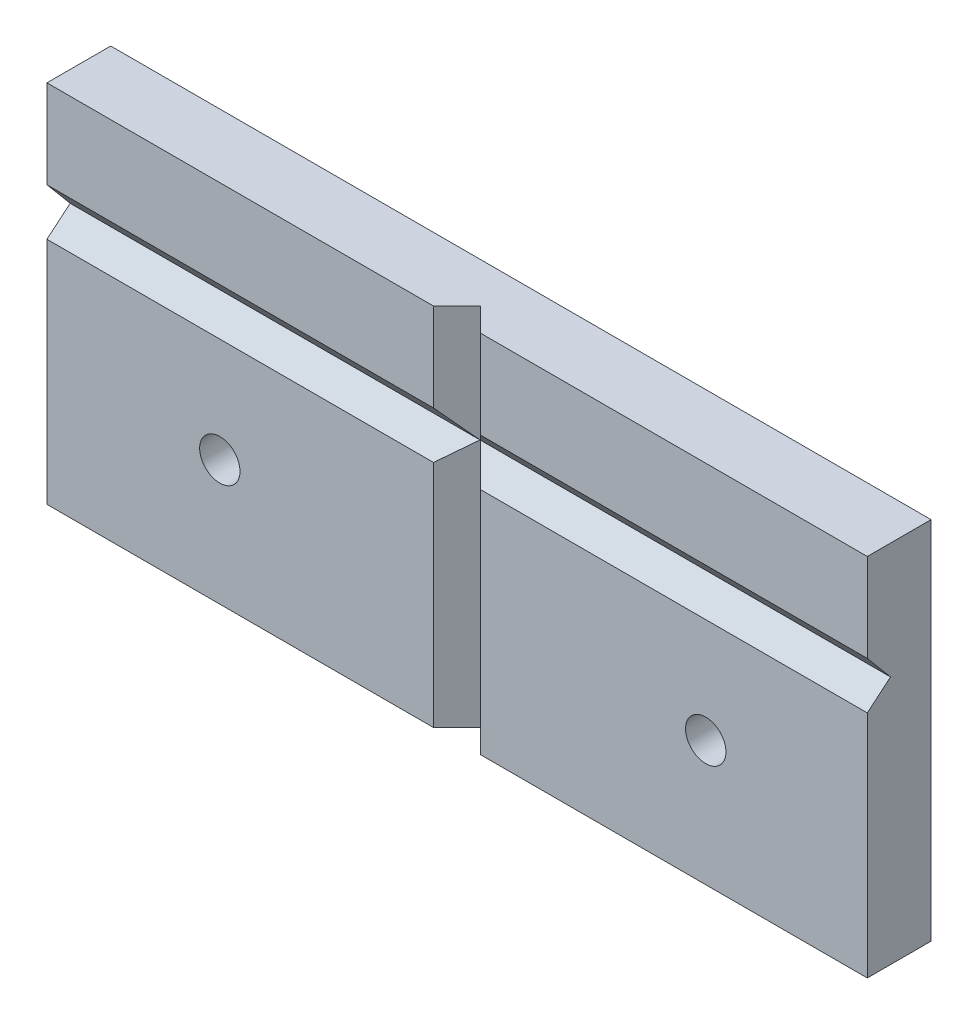
ISO-10303-21;
HEADER;
FILE_DESCRIPTION(('STEP AP214'),'2;1');
FILE_NAME('part.step','',(''),(''),'','','');
FILE_SCHEMA(('AUTOMOTIVE_DESIGN { 1 0 10303 214 1 1 1 1 }'));
ENDSEC;
DATA;
#1=APPLICATION_CONTEXT('core data for automotive mechanical design processes');
#2=APPLICATION_PROTOCOL_DEFINITION('international standard','automotive_design',2000,#1);
#3=PRODUCT_CONTEXT('',#1,'mechanical');
#4=PRODUCT('Part','Part','',(#3));
#5=PRODUCT_RELATED_PRODUCT_CATEGORY('part','',(#4));
#6=PRODUCT_DEFINITION_FORMATION('','',#4);
#7=PRODUCT_DEFINITION_CONTEXT('part definition',#1,'design');
#8=PRODUCT_DEFINITION('design','',#6,#7);
#9=PRODUCT_DEFINITION_SHAPE('','',#8);
#10=(LENGTH_UNIT() NAMED_UNIT(*) SI_UNIT(.MILLI.,.METRE.));
#11=(NAMED_UNIT(*) PLANE_ANGLE_UNIT() SI_UNIT($,.RADIAN.));
#12=(NAMED_UNIT(*) SI_UNIT($,.STERADIAN.) SOLID_ANGLE_UNIT());
#13=UNCERTAINTY_MEASURE_WITH_UNIT(LENGTH_MEASURE(1.E-05),#10,'distance_accuracy_value','');
#14=(GEOMETRIC_REPRESENTATION_CONTEXT(3) GLOBAL_UNCERTAINTY_ASSIGNED_CONTEXT((#13)) GLOBAL_UNIT_ASSIGNED_CONTEXT((#10,
#11,#12)) REPRESENTATION_CONTEXT('',''));
#15=CARTESIAN_POINT('',(0.,0.,0.));
#16=DIRECTION('',(0.,0.,1.));
#17=DIRECTION('',(1.,0.,0.));
#18=AXIS2_PLACEMENT_3D('',#15,#16,#17);
#19=CARTESIAN_POINT('',(0.,0.,7.8994));
#20=DIRECTION('',(0.,0.,1.));
#21=DIRECTION('',(1.,0.,0.));
#22=AXIS2_PLACEMENT_3D('',#19,#20,#21);
#23=PLANE('',#22);
#24=DIRECTION('',(-1.,0.,0.));
#25=VECTOR('',#24,1.);
#26=CARTESIAN_POINT('',(0.,83.312,7.8994));
#27=LINE('',#26,#25);
#28=CARTESIAN_POINT('',(0.,83.312,7.8994));
#29=VERTEX_POINT('',#28);
#30=CARTESIAN_POINT('',(-47.879,83.312,7.89939999999999));
#31=VERTEX_POINT('',#30);
#32=EDGE_CURVE('E180',#29,#31,#27,.T.);
#33=ORIENTED_EDGE('',*,*,#32,.T.);
#34=DIRECTION('',(0.,-1.,0.));
#35=VECTOR('',#34,1.);
#36=CARTESIAN_POINT('',(-47.879,236.339016687857,7.89939999999999));
#37=LINE('',#36,#35);
#38=CARTESIAN_POINT('',(-47.879,72.3761950037828,7.8994));
#39=VERTEX_POINT('',#38);
#40=EDGE_CURVE('E139',#31,#39,#37,.T.);
#41=ORIENTED_EDGE('',*,*,#40,.T.);
#42=DIRECTION('',(1.,0.,0.));
#43=VECTOR('',#42,1.);
#44=CARTESIAN_POINT('',(0.,72.3761950037828,7.8994));
#45=LINE('',#44,#43);
#46=CARTESIAN_POINT('',(0.,72.3761950037828,7.8994));
#47=VERTEX_POINT('',#46);
#48=EDGE_CURVE('E218',#39,#47,#45,.T.);
#49=ORIENTED_EDGE('',*,*,#48,.T.);
#50=DIRECTION('',(0.,1.,0.));
#51=VECTOR('',#50,1.);
#52=CARTESIAN_POINT('',(0.,38.1,7.8994));
#53=LINE('',#52,#51);
#54=EDGE_CURVE('E190',#47,#29,#53,.T.);
#55=ORIENTED_EDGE('',*,*,#54,.T.);
#56=EDGE_LOOP('',(#33,#41,#49,#55));
#57=FACE_BOUND('',#56,.T.);
#58=ADVANCED_FACE('F37',(#57),#23,.T.);
#59=CARTESIAN_POINT('',(-101.6,72.3761950037828,7.8994));
#60=VERTEX_POINT('',#59);
#61=CARTESIAN_POINT('',(-53.721,72.3761950037828,7.89939999999999));
#62=VERTEX_POINT('',#61);
#63=EDGE_CURVE('E219',#60,#62,#45,.T.);
#64=ORIENTED_EDGE('',*,*,#63,.T.);
#65=DIRECTION('',(0.,-1.,0.));
#66=VECTOR('',#65,1.);
#67=CARTESIAN_POINT('',(-53.721,236.339016687857,7.89939999999999));
#68=LINE('',#67,#66);
#69=CARTESIAN_POINT('',(-53.721,83.312,7.89939999999999));
#70=VERTEX_POINT('',#69);
#71=EDGE_CURVE('E234',#70,#62,#68,.T.);
#72=ORIENTED_EDGE('',*,*,#71,.F.);
#73=CARTESIAN_POINT('',(-101.6,83.312,7.8994));
#74=VERTEX_POINT('',#73);
#75=EDGE_CURVE('E157',#70,#74,#27,.T.);
#76=ORIENTED_EDGE('',*,*,#75,.T.);
#77=DIRECTION('',(0.,-1.,0.));
#78=VECTOR('',#77,1.);
#79=CARTESIAN_POINT('',(-101.6,83.312,7.8994));
#80=LINE('',#79,#78);
#81=EDGE_CURVE('E183',#74,#60,#80,.T.);
#82=ORIENTED_EDGE('',*,*,#81,.T.);
#83=EDGE_LOOP('',(#64,#72,#76,#82));
#84=FACE_BOUND('',#83,.T.);
#85=ADVANCED_FACE('F233',(#84),#23,.T.);
#86=CARTESIAN_POINT('',(-20.0048383256093,53.5862401288938,7.8994));
#87=DIRECTION('',(0.,0.,-1.));
#88=DIRECTION('',(-1.,0.,0.));
#89=AXIS2_PLACEMENT_3D('',#86,#87,#88);
#90=CIRCLE('',#89,2.5);
#91=CARTESIAN_POINT('',(-22.5048383256093,53.5862401288938,7.8994));
#92=VERTEX_POINT('',#91);
#93=EDGE_CURVE('E418',#92,#92,#90,.T.);
#94=ORIENTED_EDGE('',*,*,#93,.T.);
#95=EDGE_LOOP('',(#94));
#96=FACE_BOUND('',#95,.T.);
#97=DIRECTION('',(-1.,0.,0.));
#98=VECTOR('',#97,1.);
#99=CARTESIAN_POINT('',(0.,66.5341950037828,7.8994));
#100=LINE('',#99,#98);
#101=CARTESIAN_POINT('',(0.,66.5341950037828,7.8994));
#102=VERTEX_POINT('',#101);
#103=CARTESIAN_POINT('',(-47.879,66.5341950037828,7.89939999999999));
#104=VERTEX_POINT('',#103);
#105=EDGE_CURVE('E215',#102,#104,#100,.T.);
#106=ORIENTED_EDGE('',*,*,#105,.T.);
#107=CARTESIAN_POINT('',(-47.879,38.1,7.89939999999999));
#108=VERTEX_POINT('',#107);
#109=EDGE_CURVE('E235',#104,#108,#37,.T.);
#110=ORIENTED_EDGE('',*,*,#109,.T.);
#111=DIRECTION('',(1.,0.,0.));
#112=VECTOR('',#111,1.);
#113=CARTESIAN_POINT('',(-101.6,38.1,7.8994));
#114=LINE('',#113,#112);
#115=CARTESIAN_POINT('',(0.,38.1,7.8994));
#116=VERTEX_POINT('',#115);
#117=EDGE_CURVE('E186',#108,#116,#114,.T.);
#118=ORIENTED_EDGE('',*,*,#117,.T.);
#119=EDGE_CURVE('E191',#116,#102,#53,.T.);
#120=ORIENTED_EDGE('',*,*,#119,.T.);
#121=EDGE_LOOP('',(#106,#110,#118,#120));
#122=FACE_BOUND('',#121,.T.);
#123=ADVANCED_FACE('F263',(#96,#122),#23,.T.);
#124=CARTESIAN_POINT('',(-80.1872457791835,53.5862401288938,7.8994));
#125=DIRECTION('',(0.,0.,-1.));
#126=DIRECTION('',(-1.,0.,0.));
#127=AXIS2_PLACEMENT_3D('',#124,#125,#126);
#128=CIRCLE('',#127,2.5);
#129=CARTESIAN_POINT('',(-82.6872457791835,53.5862401288938,7.8994));
#130=VERTEX_POINT('',#129);
#131=EDGE_CURVE('E153',#130,#130,#128,.T.);
#132=ORIENTED_EDGE('',*,*,#131,.T.);
#133=EDGE_LOOP('',(#132));
#134=FACE_BOUND('',#133,.T.);
#135=CARTESIAN_POINT('',(-101.6,38.1,7.8994));
#136=VERTEX_POINT('',#135);
#137=CARTESIAN_POINT('',(-53.721,38.1,7.89939999999999));
#138=VERTEX_POINT('',#137);
#139=EDGE_CURVE('E187',#136,#138,#114,.T.);
#140=ORIENTED_EDGE('',*,*,#139,.T.);
#141=CARTESIAN_POINT('',(-53.721,66.5341950037828,7.89939999999999));
#142=VERTEX_POINT('',#141);
#143=EDGE_CURVE('E152',#142,#138,#68,.T.);
#144=ORIENTED_EDGE('',*,*,#143,.F.);
#145=CARTESIAN_POINT('',(-101.6,66.5341950037828,7.8994));
#146=VERTEX_POINT('',#145);
#147=EDGE_CURVE('E60',#142,#146,#100,.T.);
#148=ORIENTED_EDGE('',*,*,#147,.T.);
#149=EDGE_CURVE('E182',#146,#136,#80,.T.);
#150=ORIENTED_EDGE('',*,*,#149,.T.);
#151=EDGE_LOOP('',(#140,#144,#148,#150));
#152=FACE_BOUND('',#151,.T.);
#153=ADVANCED_FACE('F261',(#134,#152),#23,.T.);
#154=CARTESIAN_POINT('',(0.,83.312,7.8994));
#155=DIRECTION('',(0.,-1.,0.));
#156=DIRECTION('',(0.,0.,-1.));
#157=AXIS2_PLACEMENT_3D('',#154,#155,#156);
#158=PLANE('',#157);
#159=DIRECTION('',(-0.707106781186549,0.,-0.707106781186546));
#160=VECTOR('',#159,1.);
#161=CARTESIAN_POINT('',(-23.9394999999999,83.312,31.8389));
#162=LINE('',#161,#160);
#163=CARTESIAN_POINT('',(-50.8,83.312,4.9784));
#164=VERTEX_POINT('',#163);
#165=EDGE_CURVE('E133',#31,#164,#162,.T.);
#166=ORIENTED_EDGE('',*,*,#165,.F.);
#167=ORIENTED_EDGE('',*,*,#32,.F.);
#168=DIRECTION('',(0.,0.,-1.));
#169=VECTOR('',#168,1.);
#170=CARTESIAN_POINT('',(0.,83.312,7.8994));
#171=LINE('',#170,#169);
#172=CARTESIAN_POINT('',(0.,83.312,0.));
#173=VERTEX_POINT('',#172);
#174=EDGE_CURVE('E194',#29,#173,#171,.T.);
#175=ORIENTED_EDGE('',*,*,#174,.T.);
#176=DIRECTION('',(-1.,0.,0.));
#177=VECTOR('',#176,1.);
#178=CARTESIAN_POINT('',(0.,83.312,0.));
#179=LINE('',#178,#177);
#180=CARTESIAN_POINT('',(-101.6,83.312,0.));
#181=VERTEX_POINT('',#180);
#182=EDGE_CURVE('E179',#173,#181,#179,.T.);
#183=ORIENTED_EDGE('',*,*,#182,.T.);
#184=DIRECTION('',(0.,0.,-1.));
#185=VECTOR('',#184,1.);
#186=CARTESIAN_POINT('',(-101.6,83.312,7.8994));
#187=LINE('',#186,#185);
#188=EDGE_CURVE('E212',#74,#181,#187,.T.);
#189=ORIENTED_EDGE('',*,*,#188,.F.);
#190=ORIENTED_EDGE('',*,*,#75,.F.);
#191=DIRECTION('',(-0.70710678118655,0.,0.707106781186545));
#192=VECTOR('',#191,1.);
#193=CARTESIAN_POINT('',(-26.8604999999998,83.312,-18.9611));
#194=LINE('',#193,#192);
#195=EDGE_CURVE('E148',#164,#70,#194,.T.);
#196=ORIENTED_EDGE('',*,*,#195,.F.);
#197=EDGE_LOOP('',(#166,#167,#175,#183,#189,#190,#196));
#198=FACE_BOUND('',#197,.T.);
#199=ADVANCED_FACE('F39',(#198),#158,.F.);
#200=CARTESIAN_POINT('',(-31.75,38.1,7.8994));
#201=DIRECTION('',(0.,1.,0.));
#202=DIRECTION('',(0.,0.,1.));
#203=AXIS2_PLACEMENT_3D('',#200,#201,#202);
#204=PLANE('',#203);
#205=DIRECTION('',(0.707106781186549,0.,0.707106781186546));
#206=VECTOR('',#205,1.);
#207=CARTESIAN_POINT('',(-39.8145,38.1,15.9639));
#208=LINE('',#207,#206);
#209=CARTESIAN_POINT('',(-50.8,38.1,4.9784));
#210=VERTEX_POINT('',#209);
#211=EDGE_CURVE('E145',#210,#108,#208,.T.);
#212=ORIENTED_EDGE('',*,*,#211,.F.);
#213=DIRECTION('',(0.70710678118655,0.,-0.707106781186545));
#214=VECTOR('',#213,1.);
#215=CARTESIAN_POINT('',(-42.7354999999999,38.1,-3.08610000000001));
#216=LINE('',#215,#214);
#217=EDGE_CURVE('E151',#138,#210,#216,.T.);
#218=ORIENTED_EDGE('',*,*,#217,.F.);
#219=ORIENTED_EDGE('',*,*,#139,.F.);
#220=DIRECTION('',(0.,0.,-1.));
#221=VECTOR('',#220,1.);
#222=CARTESIAN_POINT('',(-101.6,38.1,7.8994));
#223=LINE('',#222,#221);
#224=CARTESIAN_POINT('',(-101.6,38.1,0.));
#225=VERTEX_POINT('',#224);
#226=EDGE_CURVE('E209',#136,#225,#223,.T.);
#227=ORIENTED_EDGE('',*,*,#226,.T.);
#228=DIRECTION('',(1.,0.,0.));
#229=VECTOR('',#228,1.);
#230=CARTESIAN_POINT('',(-31.75,38.1,0.));
#231=LINE('',#230,#229);
#232=CARTESIAN_POINT('',(0.,38.1,0.));
#233=VERTEX_POINT('',#232);
#234=EDGE_CURVE('E200',#225,#233,#231,.T.);
#235=ORIENTED_EDGE('',*,*,#234,.T.);
#236=DIRECTION('',(0.,0.,-1.));
#237=VECTOR('',#236,1.);
#238=CARTESIAN_POINT('',(0.,38.1,7.8994));
#239=LINE('',#238,#237);
#240=EDGE_CURVE('E206',#116,#233,#239,.T.);
#241=ORIENTED_EDGE('',*,*,#240,.F.);
#242=ORIENTED_EDGE('',*,*,#117,.F.);
#243=EDGE_LOOP('',(#212,#218,#219,#227,#235,#241,#242));
#244=FACE_BOUND('',#243,.T.);
#245=ADVANCED_FACE('F259',(#244),#204,.F.);
#246=CARTESIAN_POINT('',(-240.957260442585,72.3761950037828,7.8994));
#247=DIRECTION('',(0.,-0.643029175427612,0.765841680472462));
#248=DIRECTION('',(0.,-0.765841680472462,-0.643029175427612));
#249=AXIS2_PLACEMENT_3D('',#246,#247,#248);
#250=PLANE('',#249);
#251=ORIENTED_EDGE('',*,*,#48,.F.);
#252=DIRECTION('',(-0.540859973441894,-0.644159124950403,-0.540859973441892));
#253=VECTOR('',#252,1.);
#254=CARTESIAN_POINT('',(-104.360089087202,5.10775084229825,-48.5816890872022));
#255=LINE('',#254,#253);
#256=CARTESIAN_POINT('',(-50.7559428158141,68.9497832562582,5.02245718418594));
#257=VERTEX_POINT('',#256);
#258=EDGE_CURVE('E158',#39,#257,#255,.T.);
#259=ORIENTED_EDGE('',*,*,#258,.T.);
#260=DIRECTION('',(1.,0.,0.));
#261=VECTOR('',#260,1.);
#262=CARTESIAN_POINT('',(-240.957260442585,68.9497832562582,5.02245718418594));
#263=LINE('',#262,#261);
#264=CARTESIAN_POINT('',(0.,68.9497832562582,5.02245718418594));
#265=VERTEX_POINT('',#264);
#266=EDGE_CURVE('E144',#257,#265,#263,.T.);
#267=ORIENTED_EDGE('',*,*,#266,.T.);
#268=DIRECTION('',(0.,0.765841680472462,0.643029175427612));
#269=VECTOR('',#268,1.);
#270=CARTESIAN_POINT('',(0.,52.272744606418,-8.98020509578478));
#271=LINE('',#270,#269);
#272=EDGE_CURVE('E174',#265,#47,#271,.T.);
#273=ORIENTED_EDGE('',*,*,#272,.T.);
#274=EDGE_LOOP('',(#251,#259,#267,#273));
#275=FACE_BOUND('',#274,.T.);
#276=ADVANCED_FACE('F244',(#275),#250,.T.);
#277=CARTESIAN_POINT('',(-101.6,68.9497832562582,5.02245718418594));
#278=VERTEX_POINT('',#277);
#279=CARTESIAN_POINT('',(-50.844057184186,68.9497832562582,5.02245718418594));
#280=VERTEX_POINT('',#279);
#281=EDGE_CURVE('E166',#278,#280,#263,.T.);
#282=ORIENTED_EDGE('',*,*,#281,.T.);
#283=DIRECTION('',(-0.540859973441895,0.644159124950403,0.540859973441892));
#284=VECTOR('',#283,1.);
#285=CARTESIAN_POINT('',(-108.493131684691,137.609287024169,62.6715316846905));
#286=LINE('',#285,#284);
#287=EDGE_CURVE('E52',#280,#62,#286,.T.);
#288=ORIENTED_EDGE('',*,*,#287,.T.);
#289=ORIENTED_EDGE('',*,*,#63,.F.);
#290=DIRECTION('',(0.,-0.765841680472462,-0.643029175427612));
#291=VECTOR('',#290,1.);
#292=CARTESIAN_POINT('',(-101.6,78.7901920437822,13.284830609211));
#293=LINE('',#292,#291);
#294=EDGE_CURVE('E177',#60,#278,#293,.T.);
#295=ORIENTED_EDGE('',*,*,#294,.T.);
#296=EDGE_LOOP('',(#282,#288,#289,#295));
#297=FACE_BOUND('',#296,.T.);
#298=ADVANCED_FACE('F226',(#297),#250,.T.);
#299=CARTESIAN_POINT('',(-240.957260442585,68.9497832562582,5.02245718418594));
#300=DIRECTION('',(0.,0.765841680472463,0.643029175427612));
#301=DIRECTION('',(0.,-0.643029175427612,0.765841680472463));
#302=AXIS2_PLACEMENT_3D('',#299,#300,#301);
#303=PLANE('',#302);
#304=ORIENTED_EDGE('',*,*,#266,.F.);
#305=DIRECTION('',(0.608018950895575,-0.510515338362809,0.608018950895572));
#306=VECTOR('',#305,1.);
#307=CARTESIAN_POINT('',(-121.07090581744,127.988842936667,-65.2925058174398));
#308=LINE('',#307,#306);
#309=EDGE_CURVE('E11',#257,#104,#308,.T.);
#310=ORIENTED_EDGE('',*,*,#309,.T.);
#311=ORIENTED_EDGE('',*,*,#105,.F.);
#312=DIRECTION('',(0.,0.643029175427612,-0.765841680472463));
#313=VECTOR('',#312,1.);
#314=CARTESIAN_POINT('',(0.,54.7770386498402,21.9020622799707));
#315=LINE('',#314,#313);
#316=EDGE_CURVE('E169',#102,#265,#315,.T.);
#317=ORIENTED_EDGE('',*,*,#316,.T.);
#318=EDGE_LOOP('',(#304,#310,#311,#317));
#319=FACE_BOUND('',#318,.T.);
#320=ADVANCED_FACE('F348',(#319),#303,.T.);
#321=ORIENTED_EDGE('',*,*,#147,.F.);
#322=DIRECTION('',(0.608018950895575,0.510515338362808,-0.608018950895571));
#323=VECTOR('',#322,1.);
#324=CARTESIAN_POINT('',(-121.126445445378,9.93807454017429,75.3048454453773));
#325=LINE('',#324,#323);
#326=EDGE_CURVE('E45',#142,#280,#325,.T.);
#327=ORIENTED_EDGE('',*,*,#326,.T.);
#328=ORIENTED_EDGE('',*,*,#281,.F.);
#329=DIRECTION('',(0.,-0.643029175427612,0.765841680472463));
#330=VECTOR('',#329,1.);
#331=CARTESIAN_POINT('',(-101.6,73.471591212476,-0.362973425025065));
#332=LINE('',#331,#330);
#333=EDGE_CURVE('E172',#278,#146,#332,.T.);
#334=ORIENTED_EDGE('',*,*,#333,.T.);
#335=EDGE_LOOP('',(#321,#327,#328,#334));
#336=FACE_BOUND('',#335,.T.);
#337=ADVANCED_FACE('F223',(#336),#303,.T.);
#338=CARTESIAN_POINT('',(-101.6,83.312,7.8994));
#339=DIRECTION('',(1.,0.,0.));
#340=DIRECTION('',(0.,0.,-1.));
#341=AXIS2_PLACEMENT_3D('',#338,#339,#340);
#342=PLANE('',#341);
#343=ORIENTED_EDGE('',*,*,#294,.F.);
#344=ORIENTED_EDGE('',*,*,#81,.F.);
#345=ORIENTED_EDGE('',*,*,#188,.T.);
#346=DIRECTION('',(0.,-1.,0.));
#347=VECTOR('',#346,1.);
#348=CARTESIAN_POINT('',(-101.6,83.312,0.));
#349=LINE('',#348,#347);
#350=EDGE_CURVE('E197',#181,#225,#349,.T.);
#351=ORIENTED_EDGE('',*,*,#350,.T.);
#352=ORIENTED_EDGE('',*,*,#226,.F.);
#353=ORIENTED_EDGE('',*,*,#149,.F.);
#354=ORIENTED_EDGE('',*,*,#333,.F.);
#355=EDGE_LOOP('',(#343,#344,#345,#351,#352,#353,#354));
#356=FACE_BOUND('',#355,.T.);
#357=ADVANCED_FACE('F230',(#356),#342,.F.);
#358=CARTESIAN_POINT('',(0.,38.1,7.8994));
#359=DIRECTION('',(-1.,0.,0.));
#360=DIRECTION('',(0.,0.,1.));
#361=AXIS2_PLACEMENT_3D('',#358,#359,#360);
#362=PLANE('',#361);
#363=ORIENTED_EDGE('',*,*,#272,.F.);
#364=ORIENTED_EDGE('',*,*,#316,.F.);
#365=ORIENTED_EDGE('',*,*,#119,.F.);
#366=ORIENTED_EDGE('',*,*,#240,.T.);
#367=DIRECTION('',(0.,1.,0.));
#368=VECTOR('',#367,1.);
#369=CARTESIAN_POINT('',(0.,38.1,0.));
#370=LINE('',#369,#368);
#371=EDGE_CURVE('E202',#233,#173,#370,.T.);
#372=ORIENTED_EDGE('',*,*,#371,.T.);
#373=ORIENTED_EDGE('',*,*,#174,.F.);
#374=ORIENTED_EDGE('',*,*,#54,.F.);
#375=EDGE_LOOP('',(#363,#364,#365,#366,#372,#373,#374));
#376=FACE_BOUND('',#375,.T.);
#377=ADVANCED_FACE('F251',(#376),#362,.F.);
#378=CARTESIAN_POINT('',(0.,0.,0.));
#379=DIRECTION('',(0.,0.,1.));
#380=DIRECTION('',(1.,0.,0.));
#381=AXIS2_PLACEMENT_3D('',#378,#379,#380);
#382=PLANE('',#381);
#383=CARTESIAN_POINT('',(-20.0048383256093,53.5862401288938,0.));
#384=DIRECTION('',(0.,0.,-1.));
#385=DIRECTION('',(-1.,0.,0.));
#386=AXIS2_PLACEMENT_3D('',#383,#384,#385);
#387=CIRCLE('',#386,2.5);
#388=CARTESIAN_POINT('',(-22.5048383256093,53.5862401288938,0.));
#389=VERTEX_POINT('',#388);
#390=EDGE_CURVE('E421',#389,#389,#387,.T.);
#391=ORIENTED_EDGE('',*,*,#390,.F.);
#392=EDGE_LOOP('',(#391));
#393=FACE_BOUND('',#392,.T.);
#394=CARTESIAN_POINT('',(-80.1872457791835,53.5862401288938,0.));
#395=DIRECTION('',(0.,0.,-1.));
#396=DIRECTION('',(-1.,0.,0.));
#397=AXIS2_PLACEMENT_3D('',#394,#395,#396);
#398=CIRCLE('',#397,2.5);
#399=CARTESIAN_POINT('',(-82.6872457791835,53.5862401288938,0.));
#400=VERTEX_POINT('',#399);
#401=EDGE_CURVE('E423',#400,#400,#398,.T.);
#402=ORIENTED_EDGE('',*,*,#401,.F.);
#403=EDGE_LOOP('',(#402));
#404=FACE_BOUND('',#403,.T.);
#405=ORIENTED_EDGE('',*,*,#182,.F.);
#406=ORIENTED_EDGE('',*,*,#371,.F.);
#407=ORIENTED_EDGE('',*,*,#234,.F.);
#408=ORIENTED_EDGE('',*,*,#350,.F.);
#409=EDGE_LOOP('',(#405,#406,#407,#408));
#410=FACE_BOUND('',#409,.T.);
#411=ADVANCED_FACE('F255',(#393,#404,#410),#382,.F.);
#412=CARTESIAN_POINT('',(-47.879,236.339016687857,7.89939999999999));
#413=DIRECTION('',(-0.707106781186546,0.,0.707106781186549));
#414=DIRECTION('',(0.707106781186549,0.,0.707106781186546));
#415=AXIS2_PLACEMENT_3D('',#412,#413,#414);
#416=PLANE('',#415);
#417=ORIENTED_EDGE('',*,*,#40,.F.);
#418=ORIENTED_EDGE('',*,*,#165,.T.);
#419=DIRECTION('',(0.,-1.,0.));
#420=VECTOR('',#419,1.);
#421=CARTESIAN_POINT('',(-50.8,236.339016687857,4.9784));
#422=LINE('',#421,#420);
#423=EDGE_CURVE('E136',#164,#210,#422,.T.);
#424=ORIENTED_EDGE('',*,*,#423,.T.);
#425=ORIENTED_EDGE('',*,*,#211,.T.);
#426=ORIENTED_EDGE('',*,*,#109,.F.);
#427=ORIENTED_EDGE('',*,*,#309,.F.);
#428=ORIENTED_EDGE('',*,*,#258,.F.);
#429=EDGE_LOOP('',(#417,#418,#424,#425,#426,#427,#428));
#430=FACE_BOUND('',#429,.T.);
#431=ADVANCED_FACE('F135',(#430),#416,.T.);
#432=CARTESIAN_POINT('',(-50.8,236.339016687857,4.9784));
#433=DIRECTION('',(0.707106781186545,0.,0.70710678118655));
#434=DIRECTION('',(0.70710678118655,0.,-0.707106781186545));
#435=AXIS2_PLACEMENT_3D('',#432,#433,#434);
#436=PLANE('',#435);
#437=ORIENTED_EDGE('',*,*,#423,.F.);
#438=ORIENTED_EDGE('',*,*,#195,.T.);
#439=ORIENTED_EDGE('',*,*,#71,.T.);
#440=ORIENTED_EDGE('',*,*,#287,.F.);
#441=ORIENTED_EDGE('',*,*,#326,.F.);
#442=ORIENTED_EDGE('',*,*,#143,.T.);
#443=ORIENTED_EDGE('',*,*,#217,.T.);
#444=EDGE_LOOP('',(#437,#438,#439,#440,#441,#442,#443));
#445=FACE_BOUND('',#444,.T.);
#446=ADVANCED_FACE('F147',(#445),#436,.T.);
#447=CARTESIAN_POINT('',(-80.1872457791835,53.5862401288938,0.));
#448=DIRECTION('',(0.,0.,-1.));
#449=DIRECTION('',(-1.,0.,0.));
#450=AXIS2_PLACEMENT_3D('',#447,#448,#449);
#451=CYLINDRICAL_SURFACE('',#450,2.5);
#452=ORIENTED_EDGE('',*,*,#131,.F.);
#453=EDGE_LOOP('',(#452));
#454=FACE_BOUND('',#453,.T.);
#455=ORIENTED_EDGE('',*,*,#401,.T.);
#456=EDGE_LOOP('',(#455));
#457=FACE_BOUND('',#456,.T.);
#458=ADVANCED_FACE('F311',(#454,#457),#451,.F.);
#459=CARTESIAN_POINT('',(-20.0048383256093,53.5862401288938,0.));
#460=DIRECTION('',(0.,0.,-1.));
#461=DIRECTION('',(-1.,0.,0.));
#462=AXIS2_PLACEMENT_3D('',#459,#460,#461);
#463=CYLINDRICAL_SURFACE('',#462,2.5);
#464=ORIENTED_EDGE('',*,*,#93,.F.);
#465=EDGE_LOOP('',(#464));
#466=FACE_BOUND('',#465,.T.);
#467=ORIENTED_EDGE('',*,*,#390,.T.);
#468=EDGE_LOOP('',(#467));
#469=FACE_BOUND('',#468,.T.);
#470=ADVANCED_FACE('F317',(#466,#469),#463,.F.);
#471=CLOSED_SHELL('',(#58,#85,#123,#153,#199,#245,#276,#298,#320,#337,#357,#377,#411,#431,#446,
#458,#470));
#472=MANIFOLD_SOLID_BREP('B2',#471);
#473=ADVANCED_BREP_SHAPE_REPRESENTATION('',(#18,#472),#14);
#474=SHAPE_DEFINITION_REPRESENTATION(#9,#473);
ENDSEC;
END-ISO-10303-21;
